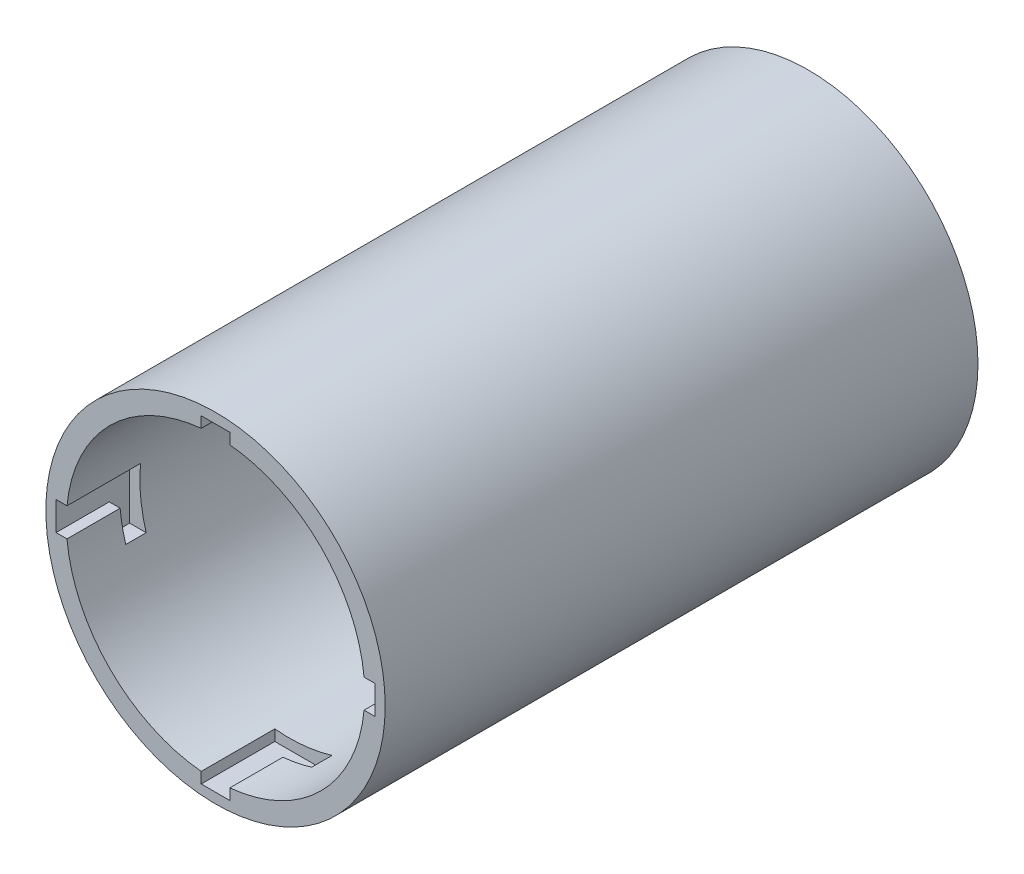
ISO-10303-21;
HEADER;
FILE_DESCRIPTION(('STEP AP214'),'2;1');
FILE_NAME('part.step','',(''),(''),'','','');
FILE_SCHEMA(('AUTOMOTIVE_DESIGN { 1 0 10303 214 1 1 1 1 }'));
ENDSEC;
DATA;
#1=APPLICATION_CONTEXT('core data for automotive mechanical design processes');
#2=APPLICATION_PROTOCOL_DEFINITION('international standard','automotive_design',2000,#1);
#3=PRODUCT_CONTEXT('',#1,'mechanical');
#4=PRODUCT('Part','Part','',(#3));
#5=PRODUCT_RELATED_PRODUCT_CATEGORY('part','',(#4));
#6=PRODUCT_DEFINITION_FORMATION('','',#4);
#7=PRODUCT_DEFINITION_CONTEXT('part definition',#1,'design');
#8=PRODUCT_DEFINITION('design','',#6,#7);
#9=PRODUCT_DEFINITION_SHAPE('','',#8);
#10=(LENGTH_UNIT() NAMED_UNIT(*) SI_UNIT(.MILLI.,.METRE.));
#11=(NAMED_UNIT(*) PLANE_ANGLE_UNIT() SI_UNIT($,.RADIAN.));
#12=(NAMED_UNIT(*) SI_UNIT($,.STERADIAN.) SOLID_ANGLE_UNIT());
#13=UNCERTAINTY_MEASURE_WITH_UNIT(LENGTH_MEASURE(1.E-05),#10,'distance_accuracy_value','');
#14=(GEOMETRIC_REPRESENTATION_CONTEXT(3) GLOBAL_UNCERTAINTY_ASSIGNED_CONTEXT((#13)) GLOBAL_UNIT_ASSIGNED_CONTEXT((#10,
#11,#12)) REPRESENTATION_CONTEXT('',''));
#15=CARTESIAN_POINT('',(0.,0.,0.));
#16=DIRECTION('',(0.,0.,1.));
#17=DIRECTION('',(1.,0.,0.));
#18=AXIS2_PLACEMENT_3D('',#15,#16,#17);
#19=CARTESIAN_POINT('',(0.,0.,140.));
#20=DIRECTION('',(0.,0.,1.));
#21=DIRECTION('',(1.,0.,0.));
#22=AXIS2_PLACEMENT_3D('',#19,#20,#21);
#23=PLANE('',#22);
#24=DIRECTION('',(1.,0.,0.));
#25=VECTOR('',#24,1.);
#26=CARTESIAN_POINT('',(-39.,-3.50000000000002,140.));
#27=LINE('',#26,#25);
#28=CARTESIAN_POINT('',(-39.,-3.50000000000002,140.));
#29=VERTEX_POINT('',#28);
#30=CARTESIAN_POINT('',(-36.3318042491699,-3.50000000000002,140.));
#31=VERTEX_POINT('',#30);
#32=EDGE_CURVE('E250',#29,#31,#27,.T.);
#33=ORIENTED_EDGE('',*,*,#32,.F.);
#34=DIRECTION('',(0.,-1.,0.));
#35=VECTOR('',#34,1.);
#36=CARTESIAN_POINT('',(-39.,-3.50000000000002,140.));
#37=LINE('',#36,#35);
#38=CARTESIAN_POINT('',(-39.,3.49999999999999,140.));
#39=VERTEX_POINT('',#38);
#40=EDGE_CURVE('E219',#39,#29,#37,.T.);
#41=ORIENTED_EDGE('',*,*,#40,.F.);
#42=DIRECTION('',(1.,0.,0.));
#43=VECTOR('',#42,1.);
#44=CARTESIAN_POINT('',(-39.,3.49999999999999,140.));
#45=LINE('',#44,#43);
#46=CARTESIAN_POINT('',(-36.3318042491699,3.49999999999999,140.));
#47=VERTEX_POINT('',#46);
#48=EDGE_CURVE('E208',#39,#47,#45,.T.);
#49=ORIENTED_EDGE('',*,*,#48,.T.);
#50=CARTESIAN_POINT('',(0.,0.,140.));
#51=DIRECTION('',(0.,0.,1.));
#52=DIRECTION('',(1.,0.,0.));
#53=AXIS2_PLACEMENT_3D('',#50,#51,#52);
#54=CIRCLE('',#53,36.5);
#55=CARTESIAN_POINT('',(-3.5,36.3318042491699,140.));
#56=VERTEX_POINT('',#55);
#57=EDGE_CURVE('E487',#56,#47,#54,.T.);
#58=ORIENTED_EDGE('',*,*,#57,.F.);
#59=DIRECTION('',(0.,-1.,0.));
#60=VECTOR('',#59,1.);
#61=CARTESIAN_POINT('',(-3.5,39.,140.));
#62=LINE('',#61,#60);
#63=CARTESIAN_POINT('',(-3.5,39.,140.));
#64=VERTEX_POINT('',#63);
#65=EDGE_CURVE('E280',#64,#56,#62,.T.);
#66=ORIENTED_EDGE('',*,*,#65,.F.);
#67=DIRECTION('',(1.,0.,0.));
#68=VECTOR('',#67,1.);
#69=CARTESIAN_POINT('',(-3.5,39.,140.));
#70=LINE('',#69,#68);
#71=CARTESIAN_POINT('',(3.5,39.,140.));
#72=VERTEX_POINT('',#71);
#73=EDGE_CURVE('E267',#64,#72,#70,.T.);
#74=ORIENTED_EDGE('',*,*,#73,.T.);
#75=DIRECTION('',(0.,-1.,0.));
#76=VECTOR('',#75,1.);
#77=CARTESIAN_POINT('',(3.5,39.,140.));
#78=LINE('',#77,#76);
#79=CARTESIAN_POINT('',(3.5,36.3318042491699,140.));
#80=VERTEX_POINT('',#79);
#81=EDGE_CURVE('E276',#72,#80,#78,.T.);
#82=ORIENTED_EDGE('',*,*,#81,.T.);
#83=CARTESIAN_POINT('',(36.3270848343547,3.54864867768001,140.));
#84=VERTEX_POINT('',#83);
#85=EDGE_CURVE('E401',#84,#80,#54,.T.);
#86=ORIENTED_EDGE('',*,*,#85,.F.);
#87=DIRECTION('',(-1.,0.,0.));
#88=VECTOR('',#87,1.);
#89=CARTESIAN_POINT('',(39.,3.54864867768001,140.));
#90=LINE('',#89,#88);
#91=CARTESIAN_POINT('',(39.,3.54864867768001,140.));
#92=VERTEX_POINT('',#91);
#93=EDGE_CURVE('E330',#92,#84,#90,.T.);
#94=ORIENTED_EDGE('',*,*,#93,.F.);
#95=DIRECTION('',(0.,-1.,0.));
#96=VECTOR('',#95,1.);
#97=CARTESIAN_POINT('',(39.,-3.45135132231999,140.));
#98=LINE('',#97,#96);
#99=CARTESIAN_POINT('',(39.,-3.45135132231999,140.));
#100=VERTEX_POINT('',#99);
#101=EDGE_CURVE('E302',#92,#100,#98,.T.);
#102=ORIENTED_EDGE('',*,*,#101,.T.);
#103=DIRECTION('',(-1.,0.,0.));
#104=VECTOR('',#103,1.);
#105=CARTESIAN_POINT('',(39.,-3.45135132231999,140.));
#106=LINE('',#105,#104);
#107=CARTESIAN_POINT('',(36.3364579183211,-3.45135132231999,140.));
#108=VERTEX_POINT('',#107);
#109=EDGE_CURVE('E326',#100,#108,#106,.T.);
#110=ORIENTED_EDGE('',*,*,#109,.T.);
#111=CARTESIAN_POINT('',(3.5,-36.3318042491699,140.));
#112=VERTEX_POINT('',#111);
#113=EDGE_CURVE('E396',#112,#108,#54,.T.);
#114=ORIENTED_EDGE('',*,*,#113,.F.);
#115=DIRECTION('',(0.,1.,0.));
#116=VECTOR('',#115,1.);
#117=CARTESIAN_POINT('',(3.5,-39.,140.));
#118=LINE('',#117,#116);
#119=CARTESIAN_POINT('',(3.5,-39.,140.));
#120=VERTEX_POINT('',#119);
#121=EDGE_CURVE('E375',#120,#112,#118,.T.);
#122=ORIENTED_EDGE('',*,*,#121,.F.);
#123=DIRECTION('',(1.,0.,0.));
#124=VECTOR('',#123,1.);
#125=CARTESIAN_POINT('',(-3.5,-39.,140.));
#126=LINE('',#125,#124);
#127=CARTESIAN_POINT('',(-3.5,-39.,140.));
#128=VERTEX_POINT('',#127);
#129=EDGE_CURVE('E345',#128,#120,#126,.T.);
#130=ORIENTED_EDGE('',*,*,#129,.F.);
#131=DIRECTION('',(0.,1.,0.));
#132=VECTOR('',#131,1.);
#133=CARTESIAN_POINT('',(-3.5,-39.,140.));
#134=LINE('',#133,#132);
#135=CARTESIAN_POINT('',(-3.5,-36.3318042491699,140.));
#136=VERTEX_POINT('',#135);
#137=EDGE_CURVE('E378',#128,#136,#134,.T.);
#138=ORIENTED_EDGE('',*,*,#137,.T.);
#139=EDGE_CURVE('E402',#31,#136,#54,.T.);
#140=ORIENTED_EDGE('',*,*,#139,.F.);
#141=EDGE_LOOP('',(#33,#41,#49,#58,#66,#74,#82,#86,#94,#102,#110,#114,#122,#130,#138,#140));
#142=FACE_BOUND('',#141,.T.);
#143=CARTESIAN_POINT('',(0.,0.,140.));
#144=DIRECTION('',(0.,0.,1.));
#145=DIRECTION('',(1.,0.,0.));
#146=AXIS2_PLACEMENT_3D('',#143,#144,#145);
#147=CIRCLE('',#146,41.5);
#148=CARTESIAN_POINT('',(41.5,0.,140.));
#149=VERTEX_POINT('',#148);
#150=EDGE_CURVE('E400',#149,#149,#147,.T.);
#151=ORIENTED_EDGE('',*,*,#150,.T.);
#152=EDGE_LOOP('',(#151));
#153=FACE_BOUND('',#152,.T.);
#154=ADVANCED_FACE('F39',(#142,#153),#23,.T.);
#155=CARTESIAN_POINT('',(0.,0.,140.));
#156=DIRECTION('',(0.,0.,-1.));
#157=DIRECTION('',(-1.,0.,0.));
#158=AXIS2_PLACEMENT_3D('',#155,#156,#157);
#159=CYLINDRICAL_SURFACE('',#158,36.5);
#160=DIRECTION('',(0.,0.,-1.));
#161=VECTOR('',#160,1.);
#162=CARTESIAN_POINT('',(-36.3318042491699,-3.50000000000002,140.));
#163=LINE('',#162,#161);
#164=CARTESIAN_POINT('',(-36.3318042491699,-3.50000000000001,127.));
#165=VERTEX_POINT('',#164);
#166=EDGE_CURVE('E11',#31,#165,#163,.T.);
#167=ORIENTED_EDGE('',*,*,#166,.F.);
#168=ORIENTED_EDGE('',*,*,#139,.T.);
#169=DIRECTION('',(0.,0.,-1.));
#170=VECTOR('',#169,1.);
#171=CARTESIAN_POINT('',(-3.5,-36.3318042491699,140.));
#172=LINE('',#171,#170);
#173=CARTESIAN_POINT('',(-3.5,-36.3318042491699,122.));
#174=VERTEX_POINT('',#173);
#175=EDGE_CURVE('E409',#174,#136,#172,.F.);
#176=ORIENTED_EDGE('',*,*,#175,.F.);
#177=CARTESIAN_POINT('',(0.,0.,122.));
#178=DIRECTION('',(0.,0.,-1.));
#179=DIRECTION('',(-1.,0.,0.));
#180=AXIS2_PLACEMENT_3D('',#177,#178,#179);
#181=CIRCLE('',#180,36.5);
#182=CARTESIAN_POINT('',(10.5,-34.9571165858971,122.));
#183=VERTEX_POINT('',#182);
#184=EDGE_CURVE('E413',#183,#174,#181,.T.);
#185=ORIENTED_EDGE('',*,*,#184,.F.);
#186=DIRECTION('',(0.,0.,-1.));
#187=VECTOR('',#186,1.);
#188=CARTESIAN_POINT('',(10.5,-34.9571165858971,140.));
#189=LINE('',#188,#187);
#190=CARTESIAN_POINT('',(10.5,-34.9571165858971,127.));
#191=VERTEX_POINT('',#190);
#192=EDGE_CURVE('E417',#191,#183,#189,.T.);
#193=ORIENTED_EDGE('',*,*,#192,.F.);
#194=CARTESIAN_POINT('',(0.,0.,127.));
#195=DIRECTION('',(0.,0.,1.));
#196=DIRECTION('',(1.,0.,0.));
#197=AXIS2_PLACEMENT_3D('',#194,#195,#196);
#198=CIRCLE('',#197,36.5);
#199=CARTESIAN_POINT('',(3.5,-36.3318042491699,127.));
#200=VERTEX_POINT('',#199);
#201=EDGE_CURVE('E420',#200,#191,#198,.T.);
#202=ORIENTED_EDGE('',*,*,#201,.F.);
#203=DIRECTION('',(0.,0.,-1.));
#204=VECTOR('',#203,1.);
#205=CARTESIAN_POINT('',(3.5,-36.3318042491699,140.));
#206=LINE('',#205,#204);
#207=EDGE_CURVE('E423',#112,#200,#206,.T.);
#208=ORIENTED_EDGE('',*,*,#207,.F.);
#209=ORIENTED_EDGE('',*,*,#113,.T.);
#210=DIRECTION('',(0.,0.,-1.));
#211=VECTOR('',#210,1.);
#212=CARTESIAN_POINT('',(36.3364579183211,-3.45135132231999,140.));
#213=LINE('',#212,#211);
#214=CARTESIAN_POINT('',(36.3364579183211,-3.45135132231999,122.));
#215=VERTEX_POINT('',#214);
#216=EDGE_CURVE('E434',#108,#215,#213,.T.);
#217=ORIENTED_EDGE('',*,*,#216,.T.);
#218=CARTESIAN_POINT('',(0.,0.,122.));
#219=DIRECTION('',(0.,0.,1.));
#220=DIRECTION('',(1.,0.,0.));
#221=AXIS2_PLACEMENT_3D('',#218,#219,#220);
#222=CIRCLE('',#221,36.5);
#223=CARTESIAN_POINT('',(34.9424671578136,10.54864867768,122.));
#224=VERTEX_POINT('',#223);
#225=EDGE_CURVE('E430',#215,#224,#222,.T.);
#226=ORIENTED_EDGE('',*,*,#225,.T.);
#227=DIRECTION('',(0.,0.,-1.));
#228=VECTOR('',#227,1.);
#229=CARTESIAN_POINT('',(34.9424671578136,10.54864867768,140.));
#230=LINE('',#229,#228);
#231=CARTESIAN_POINT('',(34.9424671578136,10.54864867768,127.));
#232=VERTEX_POINT('',#231);
#233=EDGE_CURVE('E426',#224,#232,#230,.F.);
#234=ORIENTED_EDGE('',*,*,#233,.T.);
#235=CARTESIAN_POINT('',(0.,0.,127.));
#236=DIRECTION('',(0.,0.,-1.));
#237=DIRECTION('',(-1.,0.,0.));
#238=AXIS2_PLACEMENT_3D('',#235,#236,#237);
#239=CIRCLE('',#238,36.5);
#240=CARTESIAN_POINT('',(36.3270848343547,3.54864867768001,127.));
#241=VERTEX_POINT('',#240);
#242=EDGE_CURVE('E438',#232,#241,#239,.T.);
#243=ORIENTED_EDGE('',*,*,#242,.T.);
#244=DIRECTION('',(0.,0.,-1.));
#245=VECTOR('',#244,1.);
#246=CARTESIAN_POINT('',(36.3270848343547,3.54864867768001,140.));
#247=LINE('',#246,#245);
#248=EDGE_CURVE('E442',#241,#84,#247,.F.);
#249=ORIENTED_EDGE('',*,*,#248,.T.);
#250=ORIENTED_EDGE('',*,*,#85,.T.);
#251=DIRECTION('',(0.,0.,-1.));
#252=VECTOR('',#251,1.);
#253=CARTESIAN_POINT('',(3.5,36.3318042491699,140.));
#254=LINE('',#253,#252);
#255=CARTESIAN_POINT('',(3.5,36.3318042491699,122.));
#256=VERTEX_POINT('',#255);
#257=EDGE_CURVE('E446',#80,#256,#254,.T.);
#258=ORIENTED_EDGE('',*,*,#257,.T.);
#259=CARTESIAN_POINT('',(0.,0.,122.));
#260=DIRECTION('',(0.,0.,1.));
#261=DIRECTION('',(1.,0.,0.));
#262=AXIS2_PLACEMENT_3D('',#259,#260,#261);
#263=CIRCLE('',#262,36.5);
#264=CARTESIAN_POINT('',(-10.5,34.9571165858971,122.));
#265=VERTEX_POINT('',#264);
#266=EDGE_CURVE('E450',#256,#265,#263,.T.);
#267=ORIENTED_EDGE('',*,*,#266,.T.);
#268=DIRECTION('',(0.,0.,-1.));
#269=VECTOR('',#268,1.);
#270=CARTESIAN_POINT('',(-10.5,34.9571165858971,140.));
#271=LINE('',#270,#269);
#272=CARTESIAN_POINT('',(-10.5,34.9571165858971,127.));
#273=VERTEX_POINT('',#272);
#274=EDGE_CURVE('E454',#265,#273,#271,.F.);
#275=ORIENTED_EDGE('',*,*,#274,.T.);
#276=CARTESIAN_POINT('',(0.,0.,127.));
#277=DIRECTION('',(0.,0.,-1.));
#278=DIRECTION('',(-1.,0.,0.));
#279=AXIS2_PLACEMENT_3D('',#276,#277,#278);
#280=CIRCLE('',#279,36.5);
#281=CARTESIAN_POINT('',(-3.5,36.3318042491699,127.));
#282=VERTEX_POINT('',#281);
#283=EDGE_CURVE('E458',#273,#282,#280,.T.);
#284=ORIENTED_EDGE('',*,*,#283,.T.);
#285=DIRECTION('',(0.,0.,-1.));
#286=VECTOR('',#285,1.);
#287=CARTESIAN_POINT('',(-3.5,36.3318042491699,140.));
#288=LINE('',#287,#286);
#289=EDGE_CURVE('E462',#282,#56,#288,.F.);
#290=ORIENTED_EDGE('',*,*,#289,.T.);
#291=ORIENTED_EDGE('',*,*,#57,.T.);
#292=DIRECTION('',(0.,0.,-1.));
#293=VECTOR('',#292,1.);
#294=CARTESIAN_POINT('',(-36.3318042491699,3.49999999999999,140.));
#295=LINE('',#294,#293);
#296=CARTESIAN_POINT('',(-36.3318042491699,3.49999999999999,122.));
#297=VERTEX_POINT('',#296);
#298=EDGE_CURVE('E466',#297,#47,#295,.F.);
#299=ORIENTED_EDGE('',*,*,#298,.F.);
#300=CARTESIAN_POINT('',(0.,0.,122.));
#301=DIRECTION('',(0.,0.,-1.));
#302=DIRECTION('',(-1.,0.,0.));
#303=AXIS2_PLACEMENT_3D('',#300,#301,#302);
#304=CIRCLE('',#303,36.5);
#305=CARTESIAN_POINT('',(-34.9571165858971,-10.5,122.));
#306=VERTEX_POINT('',#305);
#307=EDGE_CURVE('E205',#306,#297,#304,.T.);
#308=ORIENTED_EDGE('',*,*,#307,.F.);
#309=DIRECTION('',(0.,0.,-1.));
#310=VECTOR('',#309,1.);
#311=CARTESIAN_POINT('',(-34.9571165858971,-10.5,140.));
#312=LINE('',#311,#310);
#313=CARTESIAN_POINT('',(-34.9571165858971,-10.5,127.));
#314=VERTEX_POINT('',#313);
#315=EDGE_CURVE('E471',#314,#306,#312,.T.);
#316=ORIENTED_EDGE('',*,*,#315,.F.);
#317=CARTESIAN_POINT('',(0.,0.,127.));
#318=DIRECTION('',(0.,0.,1.));
#319=DIRECTION('',(1.,0.,0.));
#320=AXIS2_PLACEMENT_3D('',#317,#318,#319);
#321=CIRCLE('',#320,36.5);
#322=EDGE_CURVE('E48',#165,#314,#321,.T.);
#323=ORIENTED_EDGE('',*,*,#322,.F.);
#324=EDGE_LOOP('',(#167,#168,#176,#185,#193,#202,#208,#209,#217,#226,#234,#243,#249,#250,#258,
#267,#275,#284,#290,#291,#299,#308,#316,#323));
#325=FACE_BOUND('',#324,.T.);
#326=CARTESIAN_POINT('',(0.,0.,0.));
#327=DIRECTION('',(0.,0.,1.));
#328=DIRECTION('',(1.,0.,0.));
#329=AXIS2_PLACEMENT_3D('',#326,#327,#328);
#330=CIRCLE('',#329,36.5);
#331=CARTESIAN_POINT('',(36.5,0.,0.));
#332=VERTEX_POINT('',#331);
#333=EDGE_CURVE('E395',#332,#332,#330,.T.);
#334=ORIENTED_EDGE('',*,*,#333,.F.);
#335=EDGE_LOOP('',(#334));
#336=FACE_BOUND('',#335,.T.);
#337=ADVANCED_FACE('F483',(#325,#336),#159,.F.);
#338=CARTESIAN_POINT('',(0.,0.,140.));
#339=DIRECTION('',(0.,0.,-1.));
#340=DIRECTION('',(-1.,0.,0.));
#341=AXIS2_PLACEMENT_3D('',#338,#339,#340);
#342=CYLINDRICAL_SURFACE('',#341,41.5);
#343=ORIENTED_EDGE('',*,*,#150,.F.);
#344=EDGE_LOOP('',(#343));
#345=FACE_BOUND('',#344,.T.);
#346=CARTESIAN_POINT('',(0.,0.,-5.));
#347=DIRECTION('',(0.,0.,1.));
#348=DIRECTION('',(1.,0.,0.));
#349=AXIS2_PLACEMENT_3D('',#346,#347,#348);
#350=CIRCLE('',#349,41.5);
#351=CARTESIAN_POINT('',(41.5,0.,-5.));
#352=VERTEX_POINT('',#351);
#353=EDGE_CURVE('E388',#352,#352,#350,.T.);
#354=ORIENTED_EDGE('',*,*,#353,.T.);
#355=EDGE_LOOP('',(#354));
#356=FACE_BOUND('',#355,.T.);
#357=ADVANCED_FACE('F41',(#345,#356),#342,.T.);
#358=CARTESIAN_POINT('',(0.,0.,0.));
#359=DIRECTION('',(0.,0.,1.));
#360=DIRECTION('',(1.,0.,0.));
#361=AXIS2_PLACEMENT_3D('',#358,#359,#360);
#362=PLANE('',#361);
#363=CARTESIAN_POINT('',(0.,0.,0.));
#364=DIRECTION('',(0.,0.,1.));
#365=DIRECTION('',(1.,0.,0.));
#366=AXIS2_PLACEMENT_3D('',#363,#364,#365);
#367=CIRCLE('',#366,4.5);
#368=CARTESIAN_POINT('',(4.5,0.,0.));
#369=VERTEX_POINT('',#368);
#370=EDGE_CURVE('E366',#369,#369,#367,.T.);
#371=ORIENTED_EDGE('',*,*,#370,.F.);
#372=EDGE_LOOP('',(#371));
#373=FACE_BOUND('',#372,.T.);
#374=ORIENTED_EDGE('',*,*,#333,.T.);
#375=EDGE_LOOP('',(#374));
#376=FACE_BOUND('',#375,.T.);
#377=ADVANCED_FACE('F536',(#373,#376),#362,.T.);
#378=CARTESIAN_POINT('',(0.,0.,-5.));
#379=DIRECTION('',(0.,0.,1.));
#380=DIRECTION('',(1.,0.,0.));
#381=AXIS2_PLACEMENT_3D('',#378,#379,#380);
#382=PLANE('',#381);
#383=CARTESIAN_POINT('',(0.,0.,-5.));
#384=DIRECTION('',(0.,0.,1.));
#385=DIRECTION('',(1.,0.,0.));
#386=AXIS2_PLACEMENT_3D('',#383,#384,#385);
#387=CIRCLE('',#386,4.5);
#388=CARTESIAN_POINT('',(4.5,0.,-5.));
#389=VERTEX_POINT('',#388);
#390=EDGE_CURVE('E384',#389,#389,#387,.T.);
#391=ORIENTED_EDGE('',*,*,#390,.T.);
#392=EDGE_LOOP('',(#391));
#393=FACE_BOUND('',#392,.T.);
#394=ORIENTED_EDGE('',*,*,#353,.F.);
#395=EDGE_LOOP('',(#394));
#396=FACE_BOUND('',#395,.T.);
#397=ADVANCED_FACE('F539',(#393,#396),#382,.F.);
#398=CARTESIAN_POINT('',(0.,0.,-5.));
#399=DIRECTION('',(0.,0.,1.));
#400=DIRECTION('',(1.,0.,0.));
#401=AXIS2_PLACEMENT_3D('',#398,#399,#400);
#402=CYLINDRICAL_SURFACE('',#401,4.5);
#403=ORIENTED_EDGE('',*,*,#390,.F.);
#404=EDGE_LOOP('',(#403));
#405=FACE_BOUND('',#404,.T.);
#406=ORIENTED_EDGE('',*,*,#370,.T.);
#407=EDGE_LOOP('',(#406));
#408=FACE_BOUND('',#407,.T.);
#409=ADVANCED_FACE('F543',(#405,#408),#402,.F.);
#410=CARTESIAN_POINT('',(10.5,-39.,122.));
#411=DIRECTION('',(0.,0.,-1.));
#412=DIRECTION('',(-1.,0.,0.));
#413=AXIS2_PLACEMENT_3D('',#410,#411,#412);
#414=PLANE('',#413);
#415=ORIENTED_EDGE('',*,*,#184,.T.);
#416=DIRECTION('',(0.,1.,0.));
#417=VECTOR('',#416,1.);
#418=CARTESIAN_POINT('',(-3.5,-39.,122.));
#419=LINE('',#418,#417);
#420=CARTESIAN_POINT('',(-3.5,-39.,122.));
#421=VERTEX_POINT('',#420);
#422=EDGE_CURVE('E361',#421,#174,#419,.T.);
#423=ORIENTED_EDGE('',*,*,#422,.F.);
#424=DIRECTION('',(-1.,0.,0.));
#425=VECTOR('',#424,1.);
#426=CARTESIAN_POINT('',(10.5,-39.,122.));
#427=LINE('',#426,#425);
#428=CARTESIAN_POINT('',(10.5,-39.,122.));
#429=VERTEX_POINT('',#428);
#430=EDGE_CURVE('E337',#429,#421,#427,.T.);
#431=ORIENTED_EDGE('',*,*,#430,.F.);
#432=DIRECTION('',(0.,1.,0.));
#433=VECTOR('',#432,1.);
#434=CARTESIAN_POINT('',(10.5,-39.,122.));
#435=LINE('',#434,#433);
#436=EDGE_CURVE('E362',#429,#183,#435,.T.);
#437=ORIENTED_EDGE('',*,*,#436,.T.);
#438=EDGE_LOOP('',(#415,#423,#431,#437));
#439=FACE_BOUND('',#438,.T.);
#440=ADVANCED_FACE('F547',(#439),#414,.F.);
#441=CARTESIAN_POINT('',(10.5,-39.,127.));
#442=DIRECTION('',(1.,0.,0.));
#443=DIRECTION('',(0.,0.,-1.));
#444=AXIS2_PLACEMENT_3D('',#441,#442,#443);
#445=PLANE('',#444);
#446=ORIENTED_EDGE('',*,*,#192,.T.);
#447=ORIENTED_EDGE('',*,*,#436,.F.);
#448=DIRECTION('',(0.,0.,-1.));
#449=VECTOR('',#448,1.);
#450=CARTESIAN_POINT('',(10.5,-39.,127.));
#451=LINE('',#450,#449);
#452=CARTESIAN_POINT('',(10.5,-39.,127.));
#453=VERTEX_POINT('',#452);
#454=EDGE_CURVE('E357',#453,#429,#451,.T.);
#455=ORIENTED_EDGE('',*,*,#454,.F.);
#456=DIRECTION('',(0.,1.,0.));
#457=VECTOR('',#456,1.);
#458=CARTESIAN_POINT('',(10.5,-39.,127.));
#459=LINE('',#458,#457);
#460=EDGE_CURVE('E367',#453,#191,#459,.T.);
#461=ORIENTED_EDGE('',*,*,#460,.T.);
#462=EDGE_LOOP('',(#446,#447,#455,#461));
#463=FACE_BOUND('',#462,.T.);
#464=ADVANCED_FACE('F551',(#463),#445,.F.);
#465=CARTESIAN_POINT('',(3.5,-39.,127.));
#466=DIRECTION('',(0.,0.,1.));
#467=DIRECTION('',(1.,0.,0.));
#468=AXIS2_PLACEMENT_3D('',#465,#466,#467);
#469=PLANE('',#468);
#470=ORIENTED_EDGE('',*,*,#201,.T.);
#471=ORIENTED_EDGE('',*,*,#460,.F.);
#472=DIRECTION('',(1.,0.,0.));
#473=VECTOR('',#472,1.);
#474=CARTESIAN_POINT('',(3.5,-39.,127.));
#475=LINE('',#474,#473);
#476=CARTESIAN_POINT('',(3.5,-39.,127.));
#477=VERTEX_POINT('',#476);
#478=EDGE_CURVE('E353',#477,#453,#475,.T.);
#479=ORIENTED_EDGE('',*,*,#478,.F.);
#480=DIRECTION('',(0.,1.,0.));
#481=VECTOR('',#480,1.);
#482=CARTESIAN_POINT('',(3.5,-39.,127.));
#483=LINE('',#482,#481);
#484=EDGE_CURVE('E371',#477,#200,#483,.T.);
#485=ORIENTED_EDGE('',*,*,#484,.T.);
#486=EDGE_LOOP('',(#470,#471,#479,#485));
#487=FACE_BOUND('',#486,.T.);
#488=ADVANCED_FACE('F561',(#487),#469,.F.);
#489=CARTESIAN_POINT('',(3.5,-39.,140.));
#490=DIRECTION('',(1.,0.,0.));
#491=DIRECTION('',(0.,0.,-1.));
#492=AXIS2_PLACEMENT_3D('',#489,#490,#491);
#493=PLANE('',#492);
#494=ORIENTED_EDGE('',*,*,#207,.T.);
#495=ORIENTED_EDGE('',*,*,#484,.F.);
#496=DIRECTION('',(0.,0.,-1.));
#497=VECTOR('',#496,1.);
#498=CARTESIAN_POINT('',(3.5,-39.,140.));
#499=LINE('',#498,#497);
#500=EDGE_CURVE('E349',#120,#477,#499,.T.);
#501=ORIENTED_EDGE('',*,*,#500,.F.);
#502=ORIENTED_EDGE('',*,*,#121,.T.);
#503=EDGE_LOOP('',(#494,#495,#501,#502));
#504=FACE_BOUND('',#503,.T.);
#505=ADVANCED_FACE('F557',(#504),#493,.F.);
#506=CARTESIAN_POINT('',(-3.5,-39.,122.));
#507=DIRECTION('',(-1.,0.,0.));
#508=DIRECTION('',(0.,0.,1.));
#509=AXIS2_PLACEMENT_3D('',#506,#507,#508);
#510=PLANE('',#509);
#511=ORIENTED_EDGE('',*,*,#175,.T.);
#512=ORIENTED_EDGE('',*,*,#137,.F.);
#513=DIRECTION('',(0.,0.,1.));
#514=VECTOR('',#513,1.);
#515=CARTESIAN_POINT('',(-3.5,-39.,122.));
#516=LINE('',#515,#514);
#517=EDGE_CURVE('E341',#421,#128,#516,.T.);
#518=ORIENTED_EDGE('',*,*,#517,.F.);
#519=ORIENTED_EDGE('',*,*,#422,.T.);
#520=EDGE_LOOP('',(#511,#512,#518,#519));
#521=FACE_BOUND('',#520,.T.);
#522=ADVANCED_FACE('F553',(#521),#510,.F.);
#523=CARTESIAN_POINT('',(0.,-39.,0.));
#524=DIRECTION('',(0.,1.,0.));
#525=DIRECTION('',(0.,0.,1.));
#526=AXIS2_PLACEMENT_3D('',#523,#524,#525);
#527=PLANE('',#526);
#528=ORIENTED_EDGE('',*,*,#430,.T.);
#529=ORIENTED_EDGE('',*,*,#517,.T.);
#530=ORIENTED_EDGE('',*,*,#129,.T.);
#531=ORIENTED_EDGE('',*,*,#500,.T.);
#532=ORIENTED_EDGE('',*,*,#478,.T.);
#533=ORIENTED_EDGE('',*,*,#454,.T.);
#534=EDGE_LOOP('',(#528,#529,#530,#531,#532,#533));
#535=FACE_BOUND('',#534,.T.);
#536=ADVANCED_FACE('F556',(#535),#527,.T.);
#537=CARTESIAN_POINT('',(39.,3.54864867768001,127.));
#538=DIRECTION('',(0.,0.,-1.));
#539=DIRECTION('',(-1.,0.,0.));
#540=AXIS2_PLACEMENT_3D('',#537,#538,#539);
#541=PLANE('',#540);
#542=DIRECTION('',(-1.,0.,0.));
#543=VECTOR('',#542,1.);
#544=CARTESIAN_POINT('',(39.,10.54864867768,127.));
#545=LINE('',#544,#543);
#546=CARTESIAN_POINT('',(39.,10.54864867768,127.));
#547=VERTEX_POINT('',#546);
#548=EDGE_CURVE('E315',#547,#232,#545,.T.);
#549=ORIENTED_EDGE('',*,*,#548,.F.);
#550=DIRECTION('',(0.,-1.,0.));
#551=VECTOR('',#550,1.);
#552=CARTESIAN_POINT('',(39.,3.54864867768001,127.));
#553=LINE('',#552,#551);
#554=CARTESIAN_POINT('',(39.,3.54864867768001,127.));
#555=VERTEX_POINT('',#554);
#556=EDGE_CURVE('E295',#547,#555,#553,.T.);
#557=ORIENTED_EDGE('',*,*,#556,.T.);
#558=DIRECTION('',(-1.,0.,0.));
#559=VECTOR('',#558,1.);
#560=CARTESIAN_POINT('',(39.,3.54864867768001,127.));
#561=LINE('',#560,#559);
#562=EDGE_CURVE('E333',#555,#241,#561,.T.);
#563=ORIENTED_EDGE('',*,*,#562,.T.);
#564=ORIENTED_EDGE('',*,*,#242,.F.);
#565=EDGE_LOOP('',(#549,#557,#563,#564));
#566=FACE_BOUND('',#565,.T.);
#567=ADVANCED_FACE('F571',(#566),#541,.T.);
#568=CARTESIAN_POINT('',(39.,3.54864867768001,140.));
#569=DIRECTION('',(0.,-1.,0.));
#570=DIRECTION('',(0.,0.,-1.));
#571=AXIS2_PLACEMENT_3D('',#568,#569,#570);
#572=PLANE('',#571);
#573=ORIENTED_EDGE('',*,*,#562,.F.);
#574=DIRECTION('',(0.,0.,1.));
#575=VECTOR('',#574,1.);
#576=CARTESIAN_POINT('',(39.,3.54864867768001,140.));
#577=LINE('',#576,#575);
#578=EDGE_CURVE('E299',#555,#92,#577,.T.);
#579=ORIENTED_EDGE('',*,*,#578,.T.);
#580=ORIENTED_EDGE('',*,*,#93,.T.);
#581=ORIENTED_EDGE('',*,*,#248,.F.);
#582=EDGE_LOOP('',(#573,#579,#580,#581));
#583=FACE_BOUND('',#582,.T.);
#584=ADVANCED_FACE('F575',(#583),#572,.T.);
#585=CARTESIAN_POINT('',(39.,-3.45135132231999,122.));
#586=DIRECTION('',(0.,1.,0.));
#587=DIRECTION('',(0.,0.,1.));
#588=AXIS2_PLACEMENT_3D('',#585,#586,#587);
#589=PLANE('',#588);
#590=ORIENTED_EDGE('',*,*,#109,.F.);
#591=DIRECTION('',(0.,0.,-1.));
#592=VECTOR('',#591,1.);
#593=CARTESIAN_POINT('',(39.,-3.45135132231999,122.));
#594=LINE('',#593,#592);
#595=CARTESIAN_POINT('',(39.,-3.45135132231999,122.));
#596=VERTEX_POINT('',#595);
#597=EDGE_CURVE('E306',#100,#596,#594,.T.);
#598=ORIENTED_EDGE('',*,*,#597,.T.);
#599=DIRECTION('',(-1.,0.,0.));
#600=VECTOR('',#599,1.);
#601=CARTESIAN_POINT('',(39.,-3.45135132231999,122.));
#602=LINE('',#601,#600);
#603=EDGE_CURVE('E322',#596,#215,#602,.T.);
#604=ORIENTED_EDGE('',*,*,#603,.T.);
#605=ORIENTED_EDGE('',*,*,#216,.F.);
#606=EDGE_LOOP('',(#590,#598,#604,#605));
#607=FACE_BOUND('',#606,.T.);
#608=ADVANCED_FACE('F579',(#607),#589,.T.);
#609=CARTESIAN_POINT('',(39.,10.54864867768,122.));
#610=DIRECTION('',(0.,0.,1.));
#611=DIRECTION('',(1.,0.,0.));
#612=AXIS2_PLACEMENT_3D('',#609,#610,#611);
#613=PLANE('',#612);
#614=ORIENTED_EDGE('',*,*,#603,.F.);
#615=DIRECTION('',(0.,1.,0.));
#616=VECTOR('',#615,1.);
#617=CARTESIAN_POINT('',(39.,10.54864867768,122.));
#618=LINE('',#617,#616);
#619=CARTESIAN_POINT('',(39.,10.54864867768,122.));
#620=VERTEX_POINT('',#619);
#621=EDGE_CURVE('E309',#596,#620,#618,.T.);
#622=ORIENTED_EDGE('',*,*,#621,.T.);
#623=DIRECTION('',(-1.,0.,0.));
#624=VECTOR('',#623,1.);
#625=CARTESIAN_POINT('',(39.,10.54864867768,122.));
#626=LINE('',#625,#624);
#627=EDGE_CURVE('E318',#620,#224,#626,.T.);
#628=ORIENTED_EDGE('',*,*,#627,.T.);
#629=ORIENTED_EDGE('',*,*,#225,.F.);
#630=EDGE_LOOP('',(#614,#622,#628,#629));
#631=FACE_BOUND('',#630,.T.);
#632=ADVANCED_FACE('F583',(#631),#613,.T.);
#633=CARTESIAN_POINT('',(39.,10.54864867768,127.));
#634=DIRECTION('',(0.,-1.,0.));
#635=DIRECTION('',(0.,0.,-1.));
#636=AXIS2_PLACEMENT_3D('',#633,#634,#635);
#637=PLANE('',#636);
#638=ORIENTED_EDGE('',*,*,#627,.F.);
#639=DIRECTION('',(0.,0.,1.));
#640=VECTOR('',#639,1.);
#641=CARTESIAN_POINT('',(39.,10.54864867768,127.));
#642=LINE('',#641,#640);
#643=EDGE_CURVE('E312',#620,#547,#642,.T.);
#644=ORIENTED_EDGE('',*,*,#643,.T.);
#645=ORIENTED_EDGE('',*,*,#548,.T.);
#646=ORIENTED_EDGE('',*,*,#233,.F.);
#647=EDGE_LOOP('',(#638,#644,#645,#646));
#648=FACE_BOUND('',#647,.T.);
#649=ADVANCED_FACE('F587',(#648),#637,.T.);
#650=CARTESIAN_POINT('',(39.,0.,0.));
#651=DIRECTION('',(-1.,0.,0.));
#652=DIRECTION('',(0.,0.,1.));
#653=AXIS2_PLACEMENT_3D('',#650,#651,#652);
#654=PLANE('',#653);
#655=ORIENTED_EDGE('',*,*,#556,.F.);
#656=ORIENTED_EDGE('',*,*,#643,.F.);
#657=ORIENTED_EDGE('',*,*,#621,.F.);
#658=ORIENTED_EDGE('',*,*,#597,.F.);
#659=ORIENTED_EDGE('',*,*,#101,.F.);
#660=ORIENTED_EDGE('',*,*,#578,.F.);
#661=EDGE_LOOP('',(#655,#656,#657,#658,#659,#660));
#662=FACE_BOUND('',#661,.T.);
#663=ADVANCED_FACE('F591',(#662),#654,.T.);
#664=CARTESIAN_POINT('',(3.5,39.,122.));
#665=DIRECTION('',(0.,0.,1.));
#666=DIRECTION('',(1.,0.,0.));
#667=AXIS2_PLACEMENT_3D('',#664,#665,#666);
#668=PLANE('',#667);
#669=DIRECTION('',(0.,-1.,0.));
#670=VECTOR('',#669,1.);
#671=CARTESIAN_POINT('',(3.5,39.,122.));
#672=LINE('',#671,#670);
#673=CARTESIAN_POINT('',(3.5,39.,122.));
#674=VERTEX_POINT('',#673);
#675=EDGE_CURVE('E63',#674,#256,#672,.T.);
#676=ORIENTED_EDGE('',*,*,#675,.F.);
#677=DIRECTION('',(-1.,0.,0.));
#678=VECTOR('',#677,1.);
#679=CARTESIAN_POINT('',(3.5,39.,122.));
#680=LINE('',#679,#678);
#681=CARTESIAN_POINT('',(-10.5,39.,122.));
#682=VERTEX_POINT('',#681);
#683=EDGE_CURVE('E241',#674,#682,#680,.T.);
#684=ORIENTED_EDGE('',*,*,#683,.T.);
#685=DIRECTION('',(0.,-1.,0.));
#686=VECTOR('',#685,1.);
#687=CARTESIAN_POINT('',(-10.5,39.,122.));
#688=LINE('',#687,#686);
#689=EDGE_CURVE('E291',#682,#265,#688,.T.);
#690=ORIENTED_EDGE('',*,*,#689,.T.);
#691=ORIENTED_EDGE('',*,*,#266,.F.);
#692=EDGE_LOOP('',(#676,#684,#690,#691));
#693=FACE_BOUND('',#692,.T.);
#694=ADVANCED_FACE('F513',(#693),#668,.T.);
#695=CARTESIAN_POINT('',(-10.5,39.,122.));
#696=DIRECTION('',(1.,0.,0.));
#697=DIRECTION('',(0.,0.,-1.));
#698=AXIS2_PLACEMENT_3D('',#695,#696,#697);
#699=PLANE('',#698);
#700=ORIENTED_EDGE('',*,*,#689,.F.);
#701=DIRECTION('',(0.,0.,1.));
#702=VECTOR('',#701,1.);
#703=CARTESIAN_POINT('',(-10.5,39.,122.));
#704=LINE('',#703,#702);
#705=CARTESIAN_POINT('',(-10.5,39.,127.));
#706=VERTEX_POINT('',#705);
#707=EDGE_CURVE('E258',#682,#706,#704,.T.);
#708=ORIENTED_EDGE('',*,*,#707,.T.);
#709=DIRECTION('',(0.,-1.,0.));
#710=VECTOR('',#709,1.);
#711=CARTESIAN_POINT('',(-10.5,39.,127.));
#712=LINE('',#711,#710);
#713=EDGE_CURVE('E287',#706,#273,#712,.T.);
#714=ORIENTED_EDGE('',*,*,#713,.T.);
#715=ORIENTED_EDGE('',*,*,#274,.F.);
#716=EDGE_LOOP('',(#700,#708,#714,#715));
#717=FACE_BOUND('',#716,.T.);
#718=ADVANCED_FACE('F515',(#717),#699,.T.);
#719=CARTESIAN_POINT('',(-10.5,39.,127.));
#720=DIRECTION('',(0.,0.,-1.));
#721=DIRECTION('',(-1.,0.,0.));
#722=AXIS2_PLACEMENT_3D('',#719,#720,#721);
#723=PLANE('',#722);
#724=ORIENTED_EDGE('',*,*,#713,.F.);
#725=DIRECTION('',(1.,0.,0.));
#726=VECTOR('',#725,1.);
#727=CARTESIAN_POINT('',(-10.5,39.,127.));
#728=LINE('',#727,#726);
#729=CARTESIAN_POINT('',(-3.5,39.,127.));
#730=VERTEX_POINT('',#729);
#731=EDGE_CURVE('E261',#706,#730,#728,.T.);
#732=ORIENTED_EDGE('',*,*,#731,.T.);
#733=DIRECTION('',(0.,-1.,0.));
#734=VECTOR('',#733,1.);
#735=CARTESIAN_POINT('',(-3.5,39.,127.));
#736=LINE('',#735,#734);
#737=EDGE_CURVE('E283',#730,#282,#736,.T.);
#738=ORIENTED_EDGE('',*,*,#737,.T.);
#739=ORIENTED_EDGE('',*,*,#283,.F.);
#740=EDGE_LOOP('',(#724,#732,#738,#739));
#741=FACE_BOUND('',#740,.T.);
#742=ADVANCED_FACE('F518',(#741),#723,.T.);
#743=CARTESIAN_POINT('',(-3.5,39.,127.));
#744=DIRECTION('',(1.,0.,0.));
#745=DIRECTION('',(0.,0.,-1.));
#746=AXIS2_PLACEMENT_3D('',#743,#744,#745);
#747=PLANE('',#746);
#748=ORIENTED_EDGE('',*,*,#737,.F.);
#749=DIRECTION('',(0.,0.,1.));
#750=VECTOR('',#749,1.);
#751=CARTESIAN_POINT('',(-3.5,39.,127.));
#752=LINE('',#751,#750);
#753=EDGE_CURVE('E264',#730,#64,#752,.T.);
#754=ORIENTED_EDGE('',*,*,#753,.T.);
#755=ORIENTED_EDGE('',*,*,#65,.T.);
#756=ORIENTED_EDGE('',*,*,#289,.F.);
#757=EDGE_LOOP('',(#748,#754,#755,#756));
#758=FACE_BOUND('',#757,.T.);
#759=ADVANCED_FACE('F521',(#758),#747,.T.);
#760=CARTESIAN_POINT('',(3.5,39.,140.));
#761=DIRECTION('',(-1.,0.,0.));
#762=DIRECTION('',(0.,0.,1.));
#763=AXIS2_PLACEMENT_3D('',#760,#761,#762);
#764=PLANE('',#763);
#765=ORIENTED_EDGE('',*,*,#81,.F.);
#766=DIRECTION('',(0.,0.,-1.));
#767=VECTOR('',#766,1.);
#768=CARTESIAN_POINT('',(3.5,39.,140.));
#769=LINE('',#768,#767);
#770=EDGE_CURVE('E271',#72,#674,#769,.T.);
#771=ORIENTED_EDGE('',*,*,#770,.T.);
#772=ORIENTED_EDGE('',*,*,#675,.T.);
#773=ORIENTED_EDGE('',*,*,#257,.F.);
#774=EDGE_LOOP('',(#765,#771,#772,#773));
#775=FACE_BOUND('',#774,.T.);
#776=ADVANCED_FACE('F505',(#775),#764,.T.);
#777=CARTESIAN_POINT('',(0.,39.,0.));
#778=DIRECTION('',(0.,1.,0.));
#779=DIRECTION('',(0.,0.,1.));
#780=AXIS2_PLACEMENT_3D('',#777,#778,#779);
#781=PLANE('',#780);
#782=ORIENTED_EDGE('',*,*,#683,.F.);
#783=ORIENTED_EDGE('',*,*,#770,.F.);
#784=ORIENTED_EDGE('',*,*,#73,.F.);
#785=ORIENTED_EDGE('',*,*,#753,.F.);
#786=ORIENTED_EDGE('',*,*,#731,.F.);
#787=ORIENTED_EDGE('',*,*,#707,.F.);
#788=EDGE_LOOP('',(#782,#783,#784,#785,#786,#787));
#789=FACE_BOUND('',#788,.T.);
#790=ADVANCED_FACE('F508',(#789),#781,.F.);
#791=CARTESIAN_POINT('',(-39.,3.49999999999999,122.));
#792=DIRECTION('',(0.,0.,-1.));
#793=DIRECTION('',(-1.,0.,0.));
#794=AXIS2_PLACEMENT_3D('',#791,#792,#793);
#795=PLANE('',#794);
#796=ORIENTED_EDGE('',*,*,#307,.T.);
#797=DIRECTION('',(1.,0.,0.));
#798=VECTOR('',#797,1.);
#799=CARTESIAN_POINT('',(-39.,3.49999999999999,122.));
#800=LINE('',#799,#798);
#801=CARTESIAN_POINT('',(-39.,3.49999999999999,122.));
#802=VERTEX_POINT('',#801);
#803=EDGE_CURVE('E55',#802,#297,#800,.T.);
#804=ORIENTED_EDGE('',*,*,#803,.F.);
#805=DIRECTION('',(0.,1.,0.));
#806=VECTOR('',#805,1.);
#807=CARTESIAN_POINT('',(-39.,3.49999999999999,122.));
#808=LINE('',#807,#806);
#809=CARTESIAN_POINT('',(-39.,-10.5,122.));
#810=VERTEX_POINT('',#809);
#811=EDGE_CURVE('E202',#810,#802,#808,.T.);
#812=ORIENTED_EDGE('',*,*,#811,.F.);
#813=DIRECTION('',(1.,0.,0.));
#814=VECTOR('',#813,1.);
#815=CARTESIAN_POINT('',(-39.,-10.5,122.));
#816=LINE('',#815,#814);
#817=EDGE_CURVE('E238',#810,#306,#816,.T.);
#818=ORIENTED_EDGE('',*,*,#817,.T.);
#819=EDGE_LOOP('',(#796,#804,#812,#818));
#820=FACE_BOUND('',#819,.T.);
#821=ADVANCED_FACE('F199',(#820),#795,.F.);
#822=CARTESIAN_POINT('',(-39.,-10.5,122.));
#823=DIRECTION('',(0.,-1.,0.));
#824=DIRECTION('',(0.,0.,-1.));
#825=AXIS2_PLACEMENT_3D('',#822,#823,#824);
#826=PLANE('',#825);
#827=ORIENTED_EDGE('',*,*,#315,.T.);
#828=ORIENTED_EDGE('',*,*,#817,.F.);
#829=DIRECTION('',(0.,0.,-1.));
#830=VECTOR('',#829,1.);
#831=CARTESIAN_POINT('',(-39.,-10.5,122.));
#832=LINE('',#831,#830);
#833=CARTESIAN_POINT('',(-39.,-10.5,127.));
#834=VERTEX_POINT('',#833);
#835=EDGE_CURVE('E209',#834,#810,#832,.T.);
#836=ORIENTED_EDGE('',*,*,#835,.F.);
#837=DIRECTION('',(1.,0.,0.));
#838=VECTOR('',#837,1.);
#839=CARTESIAN_POINT('',(-39.,-10.5,127.));
#840=LINE('',#839,#838);
#841=EDGE_CURVE('E242',#834,#314,#840,.T.);
#842=ORIENTED_EDGE('',*,*,#841,.T.);
#843=EDGE_LOOP('',(#827,#828,#836,#842));
#844=FACE_BOUND('',#843,.T.);
#845=ADVANCED_FACE('F482',(#844),#826,.F.);
#846=CARTESIAN_POINT('',(-39.,-10.5,127.));
#847=DIRECTION('',(0.,0.,1.));
#848=DIRECTION('',(1.,0.,0.));
#849=AXIS2_PLACEMENT_3D('',#846,#847,#848);
#850=PLANE('',#849);
#851=ORIENTED_EDGE('',*,*,#322,.T.);
#852=ORIENTED_EDGE('',*,*,#841,.F.);
#853=DIRECTION('',(0.,-1.,0.));
#854=VECTOR('',#853,1.);
#855=CARTESIAN_POINT('',(-39.,-10.5,127.));
#856=LINE('',#855,#854);
#857=CARTESIAN_POINT('',(-39.,-3.50000000000001,127.));
#858=VERTEX_POINT('',#857);
#859=EDGE_CURVE('E233',#858,#834,#856,.T.);
#860=ORIENTED_EDGE('',*,*,#859,.F.);
#861=DIRECTION('',(1.,0.,0.));
#862=VECTOR('',#861,1.);
#863=CARTESIAN_POINT('',(-39.,-3.50000000000001,127.));
#864=LINE('',#863,#862);
#865=EDGE_CURVE('E246',#858,#165,#864,.T.);
#866=ORIENTED_EDGE('',*,*,#865,.T.);
#867=EDGE_LOOP('',(#851,#852,#860,#866));
#868=FACE_BOUND('',#867,.T.);
#869=ADVANCED_FACE('F476',(#868),#850,.F.);
#870=CARTESIAN_POINT('',(-39.,-3.50000000000001,127.));
#871=DIRECTION('',(0.,-1.,0.));
#872=DIRECTION('',(0.,0.,-1.));
#873=AXIS2_PLACEMENT_3D('',#870,#871,#872);
#874=PLANE('',#873);
#875=ORIENTED_EDGE('',*,*,#166,.T.);
#876=ORIENTED_EDGE('',*,*,#865,.F.);
#877=DIRECTION('',(0.,0.,-1.));
#878=VECTOR('',#877,1.);
#879=CARTESIAN_POINT('',(-39.,-3.50000000000001,127.));
#880=LINE('',#879,#878);
#881=EDGE_CURVE('E229',#29,#858,#880,.T.);
#882=ORIENTED_EDGE('',*,*,#881,.F.);
#883=ORIENTED_EDGE('',*,*,#32,.T.);
#884=EDGE_LOOP('',(#875,#876,#882,#883));
#885=FACE_BOUND('',#884,.T.);
#886=ADVANCED_FACE('F494',(#885),#874,.F.);
#887=CARTESIAN_POINT('',(-39.,3.49999999999999,140.));
#888=DIRECTION('',(0.,1.,0.));
#889=DIRECTION('',(0.,0.,1.));
#890=AXIS2_PLACEMENT_3D('',#887,#888,#889);
#891=PLANE('',#890);
#892=ORIENTED_EDGE('',*,*,#298,.T.);
#893=ORIENTED_EDGE('',*,*,#48,.F.);
#894=DIRECTION('',(0.,0.,1.));
#895=VECTOR('',#894,1.);
#896=CARTESIAN_POINT('',(-39.,3.49999999999999,140.));
#897=LINE('',#896,#895);
#898=EDGE_CURVE('E212',#802,#39,#897,.T.);
#899=ORIENTED_EDGE('',*,*,#898,.F.);
#900=ORIENTED_EDGE('',*,*,#803,.T.);
#901=EDGE_LOOP('',(#892,#893,#899,#900));
#902=FACE_BOUND('',#901,.T.);
#903=ADVANCED_FACE('F213',(#902),#891,.F.);
#904=CARTESIAN_POINT('',(-39.,0.,0.));
#905=DIRECTION('',(-1.,0.,0.));
#906=DIRECTION('',(0.,0.,1.));
#907=AXIS2_PLACEMENT_3D('',#904,#905,#906);
#908=PLANE('',#907);
#909=ORIENTED_EDGE('',*,*,#811,.T.);
#910=ORIENTED_EDGE('',*,*,#898,.T.);
#911=ORIENTED_EDGE('',*,*,#40,.T.);
#912=ORIENTED_EDGE('',*,*,#881,.T.);
#913=ORIENTED_EDGE('',*,*,#859,.T.);
#914=ORIENTED_EDGE('',*,*,#835,.T.);
#915=EDGE_LOOP('',(#909,#910,#911,#912,#913,#914));
#916=FACE_BOUND('',#915,.T.);
#917=ADVANCED_FACE('F221',(#916),#908,.F.);
#918=CLOSED_SHELL('',(#154,#337,#357,#377,#397,#409,#440,#464,#488,#505,#522,#536,#567,#584,
#608,#632,#649,#663,#694,#718,#742,#759,#776,#790,#821,#845,#869,#886,#903,#917));
#919=MANIFOLD_SOLID_BREP('B2',#918);
#920=ADVANCED_BREP_SHAPE_REPRESENTATION('',(#18,#919),#14);
#921=SHAPE_DEFINITION_REPRESENTATION(#9,#920);
ENDSEC;
END-ISO-10303-21;
